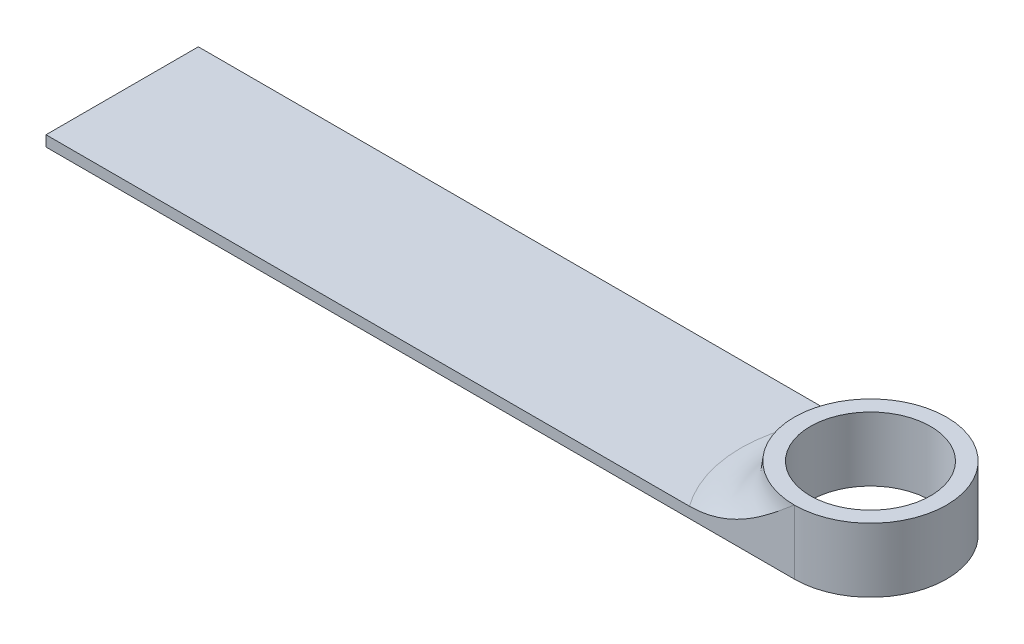
ISO-10303-21;
HEADER;
FILE_DESCRIPTION(('STEP AP214'),'2;1');
FILE_NAME('part.step','',(''),(''),'','','');
FILE_SCHEMA(('AUTOMOTIVE_DESIGN { 1 0 10303 214 1 1 1 1 }'));
ENDSEC;
DATA;
#1=APPLICATION_CONTEXT('core data for automotive mechanical design processes');
#2=APPLICATION_PROTOCOL_DEFINITION('international standard','automotive_design',2000,#1);
#3=PRODUCT_CONTEXT('',#1,'mechanical');
#4=PRODUCT('Part','Part','',(#3));
#5=PRODUCT_RELATED_PRODUCT_CATEGORY('part','',(#4));
#6=PRODUCT_DEFINITION_FORMATION('','',#4);
#7=PRODUCT_DEFINITION_CONTEXT('part definition',#1,'design');
#8=PRODUCT_DEFINITION('design','',#6,#7);
#9=PRODUCT_DEFINITION_SHAPE('','',#8);
#10=(LENGTH_UNIT() NAMED_UNIT(*) SI_UNIT(.MILLI.,.METRE.));
#11=(NAMED_UNIT(*) PLANE_ANGLE_UNIT() SI_UNIT($,.RADIAN.));
#12=(NAMED_UNIT(*) SI_UNIT($,.STERADIAN.) SOLID_ANGLE_UNIT());
#13=UNCERTAINTY_MEASURE_WITH_UNIT(LENGTH_MEASURE(1.E-05),#10,'distance_accuracy_value','');
#14=(GEOMETRIC_REPRESENTATION_CONTEXT(3) GLOBAL_UNCERTAINTY_ASSIGNED_CONTEXT((#13)) GLOBAL_UNIT_ASSIGNED_CONTEXT((#10,
#11,#12)) REPRESENTATION_CONTEXT('',''));
#15=CARTESIAN_POINT('',(0.,0.,0.));
#16=DIRECTION('',(0.,0.,1.));
#17=DIRECTION('',(1.,0.,0.));
#18=AXIS2_PLACEMENT_3D('',#15,#16,#17);
#19=CARTESIAN_POINT('',(0.,2.,0.));
#20=DIRECTION('',(0.,-1.,0.));
#21=DIRECTION('',(0.,0.,-1.));
#22=AXIS2_PLACEMENT_3D('',#19,#20,#21);
#23=PLANE('',#22);
#24=DIRECTION('',(1.,0.,0.));
#25=VECTOR('',#24,1.);
#26=CARTESIAN_POINT('',(0.,2.,14.25));
#27=LINE('',#26,#25);
#28=CARTESIAN_POINT('',(-140.,2.,14.2500000000001));
#29=VERTEX_POINT('',#28);
#30=CARTESIAN_POINT('',(-19.6214168703486,2.,14.25));
#31=VERTEX_POINT('',#30);
#32=EDGE_CURVE('E88',#29,#31,#27,.T.);
#33=ORIENTED_EDGE('',*,*,#32,.T.);
#34=CARTESIAN_POINT('',(0.,2.,0.));
#35=DIRECTION('',(0.,-1.,0.));
#36=DIRECTION('',(0.,0.,-1.));
#37=AXIS2_PLACEMENT_3D('',#34,#35,#36);
#38=CIRCLE('',#37,24.25);
#39=CARTESIAN_POINT('',(-19.6214168703486,2.,-14.25));
#40=VERTEX_POINT('',#39);
#41=EDGE_CURVE('E65',#31,#40,#38,.T.);
#42=ORIENTED_EDGE('',*,*,#41,.T.);
#43=DIRECTION('',(-1.,0.,0.));
#44=VECTOR('',#43,1.);
#45=CARTESIAN_POINT('',(0.,2.,-14.25));
#46=LINE('',#45,#44);
#47=CARTESIAN_POINT('',(-140.,2.,-14.25));
#48=VERTEX_POINT('',#47);
#49=EDGE_CURVE('E94',#40,#48,#46,.T.);
#50=ORIENTED_EDGE('',*,*,#49,.T.);
#51=DIRECTION('',(0.,0.,1.));
#52=VECTOR('',#51,1.);
#53=CARTESIAN_POINT('',(-140.,2.,-14.25));
#54=LINE('',#53,#52);
#55=EDGE_CURVE('E95',#48,#29,#54,.T.);
#56=ORIENTED_EDGE('',*,*,#55,.T.);
#57=EDGE_LOOP('',(#33,#42,#50,#56));
#58=FACE_BOUND('',#57,.T.);
#59=ADVANCED_FACE('F39',(#58),#23,.F.);
#60=CARTESIAN_POINT('',(0.,0.,0.));
#61=DIRECTION('',(0.,-1.,0.));
#62=DIRECTION('',(0.,0.,-1.));
#63=AXIS2_PLACEMENT_3D('',#60,#61,#62);
#64=PLANE('',#63);
#65=DIRECTION('',(0.,0.,1.));
#66=VECTOR('',#65,1.);
#67=CARTESIAN_POINT('',(-140.,0.,-14.25));
#68=LINE('',#67,#66);
#69=CARTESIAN_POINT('',(-140.,0.,-14.25));
#70=VERTEX_POINT('',#69);
#71=CARTESIAN_POINT('',(-140.,0.,14.2500000000001));
#72=VERTEX_POINT('',#71);
#73=EDGE_CURVE('E105',#70,#72,#68,.T.);
#74=ORIENTED_EDGE('',*,*,#73,.F.);
#75=DIRECTION('',(-1.,0.,0.));
#76=VECTOR('',#75,1.);
#77=CARTESIAN_POINT('',(0.,0.,-14.25));
#78=LINE('',#77,#76);
#79=CARTESIAN_POINT('',(0.,0.,-14.25));
#80=VERTEX_POINT('',#79);
#81=EDGE_CURVE('E101',#80,#70,#78,.T.);
#82=ORIENTED_EDGE('',*,*,#81,.F.);
#83=CARTESIAN_POINT('',(0.,0.,0.));
#84=DIRECTION('',(0.,1.,0.));
#85=DIRECTION('',(0.,0.,-1.));
#86=AXIS2_PLACEMENT_3D('',#83,#84,#85);
#87=CIRCLE('',#86,14.25);
#88=CARTESIAN_POINT('',(0.,0.,14.25));
#89=VERTEX_POINT('',#88);
#90=EDGE_CURVE('E150',#89,#80,#87,.T.);
#91=ORIENTED_EDGE('',*,*,#90,.F.);
#92=DIRECTION('',(1.,0.,0.));
#93=VECTOR('',#92,1.);
#94=CARTESIAN_POINT('',(0.,0.,14.25));
#95=LINE('',#94,#93);
#96=EDGE_CURVE('E154',#72,#89,#95,.T.);
#97=ORIENTED_EDGE('',*,*,#96,.F.);
#98=EDGE_LOOP('',(#74,#82,#91,#97));
#99=FACE_BOUND('',#98,.T.);
#100=CARTESIAN_POINT('',(0.,0.,0.));
#101=DIRECTION('',(0.,1.,0.));
#102=DIRECTION('',(0.,0.,1.));
#103=AXIS2_PLACEMENT_3D('',#100,#101,#102);
#104=CIRCLE('',#103,11.25);
#105=CARTESIAN_POINT('',(0.,0.,11.25));
#106=VERTEX_POINT('',#105);
#107=EDGE_CURVE('E155',#106,#106,#104,.T.);
#108=ORIENTED_EDGE('',*,*,#107,.T.);
#109=EDGE_LOOP('',(#108));
#110=FACE_BOUND('',#109,.T.);
#111=ADVANCED_FACE('F122',(#99,#110),#64,.T.);
#112=CARTESIAN_POINT('',(-140.,2.,-14.25));
#113=DIRECTION('',(1.,0.,0.));
#114=DIRECTION('',(0.,0.,-1.));
#115=AXIS2_PLACEMENT_3D('',#112,#113,#114);
#116=PLANE('',#115);
#117=ORIENTED_EDGE('',*,*,#73,.T.);
#118=DIRECTION('',(0.,-1.,0.));
#119=VECTOR('',#118,1.);
#120=CARTESIAN_POINT('',(-140.,2.,14.2500000000001));
#121=LINE('',#120,#119);
#122=EDGE_CURVE('E92',#29,#72,#121,.T.);
#123=ORIENTED_EDGE('',*,*,#122,.F.);
#124=ORIENTED_EDGE('',*,*,#55,.F.);
#125=DIRECTION('',(0.,-1.,0.));
#126=VECTOR('',#125,1.);
#127=CARTESIAN_POINT('',(-140.,2.,-14.25));
#128=LINE('',#127,#126);
#129=EDGE_CURVE('E148',#48,#70,#128,.T.);
#130=ORIENTED_EDGE('',*,*,#129,.T.);
#131=EDGE_LOOP('',(#117,#123,#124,#130));
#132=FACE_BOUND('',#131,.T.);
#133=ADVANCED_FACE('F103',(#132),#116,.F.);
#134=CARTESIAN_POINT('',(0.,2.,14.25));
#135=DIRECTION('',(0.,0.,-1.));
#136=DIRECTION('',(-1.,0.,0.));
#137=AXIS2_PLACEMENT_3D('',#134,#135,#136);
#138=PLANE('',#137);
#139=ORIENTED_EDGE('',*,*,#96,.T.);
#140=DIRECTION('',(0.,-1.,0.));
#141=VECTOR('',#140,1.);
#142=CARTESIAN_POINT('',(0.,2.,14.25));
#143=LINE('',#142,#141);
#144=CARTESIAN_POINT('',(0.,12.,14.25));
#145=VERTEX_POINT('',#144);
#146=EDGE_CURVE('E106',#145,#89,#143,.T.);
#147=ORIENTED_EDGE('',*,*,#146,.F.);
#148=CARTESIAN_POINT('',(-19.6214168703486,2.,14.25));
#149=CARTESIAN_POINT('',(-19.1958397209062,1.9999805140526,14.25));
#150=CARTESIAN_POINT('',(-18.7704729144833,2.01778028462404,14.25));
#151=CARTESIAN_POINT('',(-17.9229114553725,2.08639620523507,14.25));
#152=CARTESIAN_POINT('',(-17.5007135185239,2.13717131363902,14.25));
#153=CARTESIAN_POINT('',(-16.665367387919,2.2684693019237,14.25));
#154=CARTESIAN_POINT('',(-16.2521709211771,2.34868986153497,14.25));
#155=CARTESIAN_POINT('',(-15.4319030664324,2.53640698076236,14.25));
#156=CARTESIAN_POINT('',(-15.0248344312245,2.64391543304272,14.25));
#157=CARTESIAN_POINT('',(-13.9447327131558,2.96493865120102,14.25));
#158=CARTESIAN_POINT('',(-13.2783212202087,3.20093044001375,14.25));
#159=CARTESIAN_POINT('',(-11.9691354581899,3.73116186826979,14.25));
#160=CARTESIAN_POINT('',(-11.3263741916795,4.02543299781452,14.25));
#161=CARTESIAN_POINT('',(-10.0614437383442,4.66338168532915,14.25));
#162=CARTESIAN_POINT('',(-9.43941412917872,5.00733347248052,14.25));
#163=CARTESIAN_POINT('',(-8.21846416054043,5.73351031938448,14.25));
#164=CARTESIAN_POINT('',(-7.61954057933856,6.11573001643634,14.25));
#165=CARTESIAN_POINT('',(-5.79990707442539,7.34229355515745,14.25));
#166=CARTESIAN_POINT('',(-4.61298473183618,8.23626267877338,14.25));
#167=CARTESIAN_POINT('',(-2.29017250127405,10.0817180745051,14.25));
#168=CARTESIAN_POINT('',(-1.15420655352644,11.033113287806,14.2499999999999));
#169=CARTESIAN_POINT('',(-0.0122010667027498,11.9897790726387,14.25));
#170=CARTESIAN_POINT('',(-0.00610053436785463,11.9948895362736,14.25));
#171=CARTESIAN_POINT('',(0.,12.,14.25));
#172=B_SPLINE_CURVE_WITH_KNOTS('',3,(#148,#149,#150,#151,#152,#153,#154,#155,#156,#157,#158,
#159,#160,#161,#162,#163,#164,#165,#166,#167,#168,#169,#170,#171),.UNSPECIFIED.,.F.,.F.,(4,2,2,
2,2,2,2,2,2,2,2,4),(0.,1.27605249820332,2.55051983679136,3.8122522359287,5.07453547284533,
7.19186290513864,9.3103375306525,11.4409874729595,13.5713392519302,18.0236298796711,
22.4690372207958,22.4929118935685),.UNSPECIFIED.);
#173=EDGE_CURVE('E52',#145,#31,#172,.F.);
#174=ORIENTED_EDGE('',*,*,#173,.T.);
#175=ORIENTED_EDGE('',*,*,#32,.F.);
#176=ORIENTED_EDGE('',*,*,#122,.T.);
#177=EDGE_LOOP('',(#139,#147,#174,#175,#176));
#178=FACE_BOUND('',#177,.T.);
#179=ADVANCED_FACE('F90',(#178),#138,.F.);
#180=CARTESIAN_POINT('',(0.,2.,0.));
#181=DIRECTION('',(0.,-1.,0.));
#182=DIRECTION('',(0.,0.,-1.));
#183=AXIS2_PLACEMENT_3D('',#180,#181,#182);
#184=CYLINDRICAL_SURFACE('',#183,14.25);
#185=CARTESIAN_POINT('',(0.,12.,0.));
#186=DIRECTION('',(0.,1.,0.));
#187=DIRECTION('',(1.,0.,0.));
#188=AXIS2_PLACEMENT_3D('',#185,#186,#187);
#189=CIRCLE('',#188,14.25);
#190=CARTESIAN_POINT('',(0.,12.,-14.25));
#191=VERTEX_POINT('',#190);
#192=EDGE_CURVE('E165',#145,#191,#189,.T.);
#193=ORIENTED_EDGE('',*,*,#192,.F.);
#194=ORIENTED_EDGE('',*,*,#146,.T.);
#195=ORIENTED_EDGE('',*,*,#90,.T.);
#196=DIRECTION('',(0.,-1.,0.));
#197=VECTOR('',#196,1.);
#198=CARTESIAN_POINT('',(0.,2.,-14.25));
#199=LINE('',#198,#197);
#200=EDGE_CURVE('E110',#191,#80,#199,.T.);
#201=ORIENTED_EDGE('',*,*,#200,.F.);
#202=EDGE_LOOP('',(#193,#194,#195,#201));
#203=FACE_BOUND('',#202,.T.);
#204=ADVANCED_FACE('F120',(#203),#184,.T.);
#205=CARTESIAN_POINT('',(0.,2.,-14.25));
#206=DIRECTION('',(0.,0.,1.));
#207=DIRECTION('',(1.,0.,0.));
#208=AXIS2_PLACEMENT_3D('',#205,#206,#207);
#209=PLANE('',#208);
#210=ORIENTED_EDGE('',*,*,#81,.T.);
#211=ORIENTED_EDGE('',*,*,#129,.F.);
#212=ORIENTED_EDGE('',*,*,#49,.F.);
#213=CARTESIAN_POINT('',(-19.6214168703486,2.,-14.25));
#214=CARTESIAN_POINT('',(-19.1958397209068,1.9999805140526,-14.25));
#215=CARTESIAN_POINT('',(-18.7704729144845,2.01778028462399,-14.25));
#216=CARTESIAN_POINT('',(-17.9229114553749,2.08639620523484,-14.25));
#217=CARTESIAN_POINT('',(-17.5007135185268,2.13717131363865,-14.25));
#218=CARTESIAN_POINT('',(-16.665367387922,2.26846930192316,-14.25));
#219=CARTESIAN_POINT('',(-16.2521709211794,2.34868986153448,-14.25));
#220=CARTESIAN_POINT('',(-15.4319030664335,2.53640698076206,-14.25));
#221=CARTESIAN_POINT('',(-15.0248344312251,2.64391543304255,-14.25));
#222=CARTESIAN_POINT('',(-13.9447327131552,2.9649386512012,-14.25));
#223=CARTESIAN_POINT('',(-13.2783212202074,3.20093044001418,-14.25));
#224=CARTESIAN_POINT('',(-11.9691354581876,3.73116186827083,-14.25));
#225=CARTESIAN_POINT('',(-11.3263741916767,4.02543299781593,-14.25));
#226=CARTESIAN_POINT('',(-10.0614437383415,4.66338168533051,-14.25));
#227=CARTESIAN_POINT('',(-9.43941412917652,5.00733347248137,-14.25));
#228=CARTESIAN_POINT('',(-8.2184641605398,5.73351031938532,-14.25));
#229=CARTESIAN_POINT('',(-7.61954057933903,6.11573001643768,-14.25));
#230=CARTESIAN_POINT('',(-5.79990707442395,7.34229355515494,-14.25));
#231=CARTESIAN_POINT('',(-4.61298473182657,8.23626267876033,-14.25));
#232=CARTESIAN_POINT('',(-2.29017250128522,10.0817180745169,-14.25));
#233=CARTESIAN_POINT('',(-1.15420655356653,11.0331132878531,-14.2499999999999));
#234=CARTESIAN_POINT('',(-0.0122010667031315,11.9897790726393,-14.25));
#235=CARTESIAN_POINT('',(-0.00610053436805,11.9948895362738,-14.25));
#236=CARTESIAN_POINT('',(0.,12.,-14.25));
#237=B_SPLINE_CURVE_WITH_KNOTS('',3,(#213,#214,#215,#216,#217,#218,#219,#220,#221,#222,#223,
#224,#225,#226,#227,#228,#229,#230,#231,#232,#233,#234,#235,#236),.UNSPECIFIED.,.F.,.F.,(4,2,2,
2,2,2,2,2,2,2,2,4),(0.,1.27605249820159,2.5505198367878,3.81225223592688,5.07453547284533,
7.19186290514065,9.31033753065621,11.440987472961,13.5713392519302,18.0236298796696,
22.4690372207959,22.4929118935685),.UNSPECIFIED.);
#238=EDGE_CURVE('E12',#40,#191,#237,.T.);
#239=ORIENTED_EDGE('',*,*,#238,.T.);
#240=ORIENTED_EDGE('',*,*,#200,.T.);
#241=EDGE_LOOP('',(#210,#211,#212,#239,#240));
#242=FACE_BOUND('',#241,.T.);
#243=ADVANCED_FACE('F135',(#242),#209,.F.);
#244=CARTESIAN_POINT('',(0.,2.,0.));
#245=DIRECTION('',(0.,-1.,0.));
#246=DIRECTION('',(0.,0.,-1.));
#247=AXIS2_PLACEMENT_3D('',#244,#245,#246);
#248=CYLINDRICAL_SURFACE('',#247,11.25);
#249=ORIENTED_EDGE('',*,*,#107,.F.);
#250=EDGE_LOOP('',(#249));
#251=FACE_BOUND('',#250,.T.);
#252=CARTESIAN_POINT('',(0.,12.,0.));
#253=DIRECTION('',(0.,1.,0.));
#254=DIRECTION('',(0.,0.,1.));
#255=AXIS2_PLACEMENT_3D('',#252,#253,#254);
#256=CIRCLE('',#255,11.25);
#257=CARTESIAN_POINT('',(0.,12.,11.25));
#258=VERTEX_POINT('',#257);
#259=EDGE_CURVE('E172',#258,#258,#256,.T.);
#260=ORIENTED_EDGE('',*,*,#259,.T.);
#261=EDGE_LOOP('',(#260));
#262=FACE_BOUND('',#261,.T.);
#263=ADVANCED_FACE('F133',(#251,#262),#248,.F.);
#264=CARTESIAN_POINT('',(0.,12.,0.));
#265=DIRECTION('',(0.,1.,0.));
#266=DIRECTION('',(0.,0.,1.));
#267=AXIS2_PLACEMENT_3D('',#264,#265,#266);
#268=PLANE('',#267);
#269=EDGE_CURVE('E159',#191,#145,#189,.T.);
#270=ORIENTED_EDGE('',*,*,#269,.T.);
#271=ORIENTED_EDGE('',*,*,#192,.T.);
#272=EDGE_LOOP('',(#270,#271));
#273=FACE_BOUND('',#272,.T.);
#274=ORIENTED_EDGE('',*,*,#259,.F.);
#275=EDGE_LOOP('',(#274));
#276=FACE_BOUND('',#275,.T.);
#277=ADVANCED_FACE('F143',(#273,#276),#268,.T.);
#278=CARTESIAN_POINT('',(0.,12.,0.));
#279=DIRECTION('',(0.,-1.,0.));
#280=DIRECTION('',(0.,0.,-1.));
#281=AXIS2_PLACEMENT_3D('',#278,#279,#280);
#282=TOROIDAL_SURFACE('',#281,24.25,10.);
#283=ORIENTED_EDGE('',*,*,#238,.F.);
#284=ORIENTED_EDGE('',*,*,#41,.F.);
#285=ORIENTED_EDGE('',*,*,#173,.F.);
#286=ORIENTED_EDGE('',*,*,#269,.F.);
#287=EDGE_LOOP('',(#283,#284,#285,#286));
#288=FACE_BOUND('',#287,.T.);
#289=ADVANCED_FACE('F41',(#288),#282,.F.);
#290=CLOSED_SHELL('',(#59,#111,#133,#179,#204,#243,#263,#277,#289));
#291=MANIFOLD_SOLID_BREP('B2',#290);
#292=ADVANCED_BREP_SHAPE_REPRESENTATION('',(#18,#291),#14);
#293=SHAPE_DEFINITION_REPRESENTATION(#9,#292);
ENDSEC;
END-ISO-10303-21;
